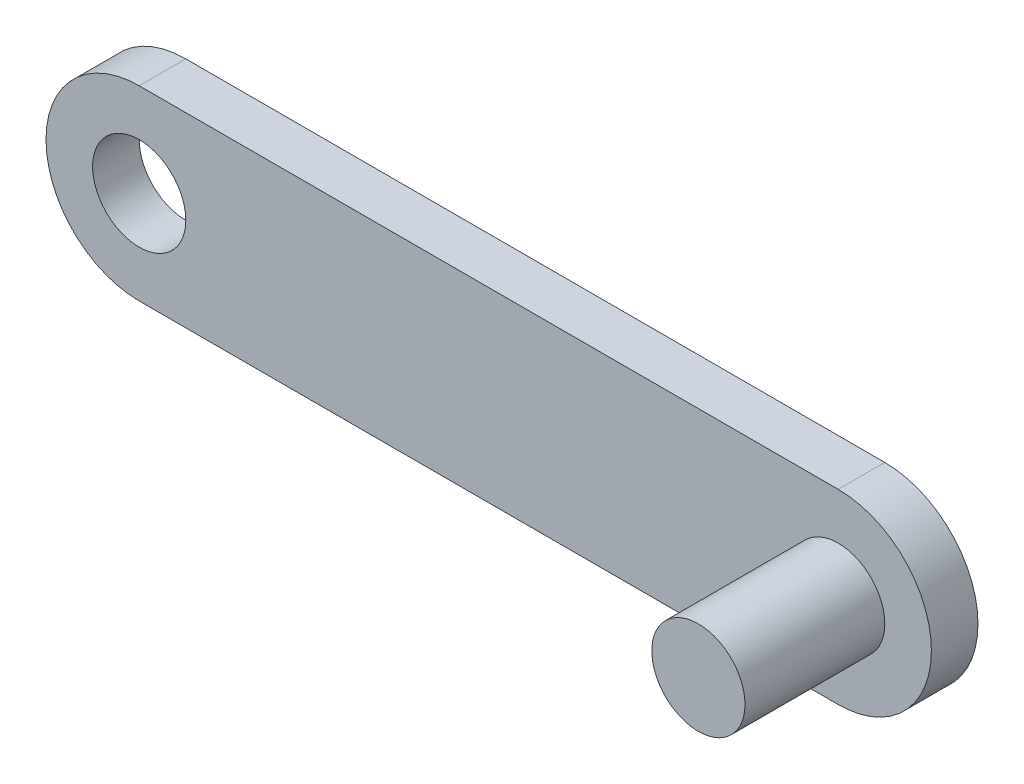
ISO-10303-21;
HEADER;
FILE_DESCRIPTION(('STEP AP214'),'2;1');
FILE_NAME('part.step','',(''),(''),'','','');
FILE_SCHEMA(('AUTOMOTIVE_DESIGN { 1 0 10303 214 1 1 1 1 }'));
ENDSEC;
DATA;
#1=APPLICATION_CONTEXT('core data for automotive mechanical design processes');
#2=APPLICATION_PROTOCOL_DEFINITION('international standard','automotive_design',2000,#1);
#3=PRODUCT_CONTEXT('',#1,'mechanical');
#4=PRODUCT('Part','Part','',(#3));
#5=PRODUCT_RELATED_PRODUCT_CATEGORY('part','',(#4));
#6=PRODUCT_DEFINITION_FORMATION('','',#4);
#7=PRODUCT_DEFINITION_CONTEXT('part definition',#1,'design');
#8=PRODUCT_DEFINITION('design','',#6,#7);
#9=PRODUCT_DEFINITION_SHAPE('','',#8);
#10=(LENGTH_UNIT() NAMED_UNIT(*) SI_UNIT(.MILLI.,.METRE.));
#11=(NAMED_UNIT(*) PLANE_ANGLE_UNIT() SI_UNIT($,.RADIAN.));
#12=(NAMED_UNIT(*) SI_UNIT($,.STERADIAN.) SOLID_ANGLE_UNIT());
#13=UNCERTAINTY_MEASURE_WITH_UNIT(LENGTH_MEASURE(1.E-05),#10,'distance_accuracy_value','');
#14=(GEOMETRIC_REPRESENTATION_CONTEXT(3) GLOBAL_UNCERTAINTY_ASSIGNED_CONTEXT((#13)) GLOBAL_UNIT_ASSIGNED_CONTEXT((#10,
#11,#12)) REPRESENTATION_CONTEXT('',''));
#15=CARTESIAN_POINT('',(0.,0.,0.));
#16=DIRECTION('',(0.,0.,1.));
#17=DIRECTION('',(1.,0.,0.));
#18=AXIS2_PLACEMENT_3D('',#15,#16,#17);
#19=CARTESIAN_POINT('',(0.,0.,1.));
#20=DIRECTION('',(0.,0.,1.));
#21=DIRECTION('',(1.,0.,0.));
#22=AXIS2_PLACEMENT_3D('',#19,#20,#21);
#23=PLANE('',#22);
#24=CARTESIAN_POINT('',(15.,0.,1.));
#25=DIRECTION('',(0.,0.,1.));
#26=DIRECTION('',(1.,0.,0.));
#27=AXIS2_PLACEMENT_3D('',#24,#25,#26);
#28=CIRCLE('',#27,1.);
#29=CARTESIAN_POINT('',(16.,0.,1.));
#30=VERTEX_POINT('',#29);
#31=EDGE_CURVE('E138',#30,#30,#28,.T.);
#32=ORIENTED_EDGE('',*,*,#31,.F.);
#33=EDGE_LOOP('',(#32));
#34=FACE_BOUND('',#33,.T.);
#35=CARTESIAN_POINT('',(0.,0.,1.));
#36=DIRECTION('',(0.,0.,1.));
#37=DIRECTION('',(1.,0.,0.));
#38=AXIS2_PLACEMENT_3D('',#35,#36,#37);
#39=CIRCLE('',#38,2.);
#40=CARTESIAN_POINT('',(0.,2.,1.));
#41=VERTEX_POINT('',#40);
#42=CARTESIAN_POINT('',(0.,-2.,1.));
#43=VERTEX_POINT('',#42);
#44=EDGE_CURVE('E92',#41,#43,#39,.T.);
#45=ORIENTED_EDGE('',*,*,#44,.T.);
#46=DIRECTION('',(1.,0.,0.));
#47=VECTOR('',#46,1.);
#48=CARTESIAN_POINT('',(0.,-2.,1.));
#49=LINE('',#48,#47);
#50=CARTESIAN_POINT('',(15.,-2.,1.));
#51=VERTEX_POINT('',#50);
#52=EDGE_CURVE('E87',#43,#51,#49,.T.);
#53=ORIENTED_EDGE('',*,*,#52,.T.);
#54=CARTESIAN_POINT('',(15.,0.,1.));
#55=DIRECTION('',(0.,0.,1.));
#56=DIRECTION('',(1.,0.,0.));
#57=AXIS2_PLACEMENT_3D('',#54,#55,#56);
#58=CIRCLE('',#57,2.);
#59=CARTESIAN_POINT('',(15.,2.,1.));
#60=VERTEX_POINT('',#59);
#61=EDGE_CURVE('E90',#51,#60,#58,.T.);
#62=ORIENTED_EDGE('',*,*,#61,.T.);
#63=DIRECTION('',(-1.,0.,0.));
#64=VECTOR('',#63,1.);
#65=CARTESIAN_POINT('',(0.,2.,1.));
#66=LINE('',#65,#64);
#67=EDGE_CURVE('E57',#60,#41,#66,.T.);
#68=ORIENTED_EDGE('',*,*,#67,.T.);
#69=EDGE_LOOP('',(#45,#53,#62,#68));
#70=FACE_BOUND('',#69,.T.);
#71=CARTESIAN_POINT('',(0.,0.,1.));
#72=DIRECTION('',(0.,0.,1.));
#73=DIRECTION('',(1.,0.,0.));
#74=AXIS2_PLACEMENT_3D('',#71,#72,#73);
#75=CIRCLE('',#74,1.);
#76=CARTESIAN_POINT('',(1.,0.,1.));
#77=VERTEX_POINT('',#76);
#78=EDGE_CURVE('E112',#77,#77,#75,.T.);
#79=ORIENTED_EDGE('',*,*,#78,.F.);
#80=EDGE_LOOP('',(#79));
#81=FACE_BOUND('',#80,.T.);
#82=ADVANCED_FACE('F39',(#34,#70,#81),#23,.T.);
#83=CARTESIAN_POINT('',(0.,0.,0.));
#84=DIRECTION('',(0.,0.,1.));
#85=DIRECTION('',(1.,0.,0.));
#86=AXIS2_PLACEMENT_3D('',#83,#84,#85);
#87=PLANE('',#86);
#88=CARTESIAN_POINT('',(0.,0.,0.));
#89=DIRECTION('',(0.,0.,1.));
#90=DIRECTION('',(1.,0.,0.));
#91=AXIS2_PLACEMENT_3D('',#88,#89,#90);
#92=CIRCLE('',#91,2.);
#93=CARTESIAN_POINT('',(0.,2.,0.));
#94=VERTEX_POINT('',#93);
#95=CARTESIAN_POINT('',(0.,-2.,0.));
#96=VERTEX_POINT('',#95);
#97=EDGE_CURVE('E108',#94,#96,#92,.T.);
#98=ORIENTED_EDGE('',*,*,#97,.F.);
#99=DIRECTION('',(-1.,0.,0.));
#100=VECTOR('',#99,1.);
#101=CARTESIAN_POINT('',(0.,2.,0.));
#102=LINE('',#101,#100);
#103=CARTESIAN_POINT('',(15.,2.,0.));
#104=VERTEX_POINT('',#103);
#105=EDGE_CURVE('E80',#104,#94,#102,.T.);
#106=ORIENTED_EDGE('',*,*,#105,.F.);
#107=CARTESIAN_POINT('',(15.,0.,0.));
#108=DIRECTION('',(0.,0.,1.));
#109=DIRECTION('',(1.,0.,0.));
#110=AXIS2_PLACEMENT_3D('',#107,#108,#109);
#111=CIRCLE('',#110,2.);
#112=CARTESIAN_POINT('',(15.,-2.,0.));
#113=VERTEX_POINT('',#112);
#114=EDGE_CURVE('E74',#113,#104,#111,.T.);
#115=ORIENTED_EDGE('',*,*,#114,.F.);
#116=DIRECTION('',(1.,0.,0.));
#117=VECTOR('',#116,1.);
#118=CARTESIAN_POINT('',(0.,-2.,0.));
#119=LINE('',#118,#117);
#120=EDGE_CURVE('E97',#96,#113,#119,.T.);
#121=ORIENTED_EDGE('',*,*,#120,.F.);
#122=EDGE_LOOP('',(#98,#106,#115,#121));
#123=FACE_BOUND('',#122,.T.);
#124=CARTESIAN_POINT('',(0.,0.,0.));
#125=DIRECTION('',(0.,0.,1.));
#126=DIRECTION('',(1.,0.,0.));
#127=AXIS2_PLACEMENT_3D('',#124,#125,#126);
#128=CIRCLE('',#127,1.);
#129=CARTESIAN_POINT('',(1.,0.,0.));
#130=VERTEX_POINT('',#129);
#131=EDGE_CURVE('E130',#130,#130,#128,.T.);
#132=ORIENTED_EDGE('',*,*,#131,.T.);
#133=EDGE_LOOP('',(#132));
#134=FACE_BOUND('',#133,.T.);
#135=ADVANCED_FACE('F125',(#123,#134),#87,.F.);
#136=CARTESIAN_POINT('',(0.,0.,1.));
#137=DIRECTION('',(0.,0.,-1.));
#138=DIRECTION('',(-1.,0.,0.));
#139=AXIS2_PLACEMENT_3D('',#136,#137,#138);
#140=CYLINDRICAL_SURFACE('',#139,2.);
#141=ORIENTED_EDGE('',*,*,#97,.T.);
#142=DIRECTION('',(0.,0.,-1.));
#143=VECTOR('',#142,1.);
#144=CARTESIAN_POINT('',(0.,-2.,1.));
#145=LINE('',#144,#143);
#146=EDGE_CURVE('E11',#43,#96,#145,.T.);
#147=ORIENTED_EDGE('',*,*,#146,.F.);
#148=ORIENTED_EDGE('',*,*,#44,.F.);
#149=DIRECTION('',(0.,0.,-1.));
#150=VECTOR('',#149,1.);
#151=CARTESIAN_POINT('',(0.,2.,1.));
#152=LINE('',#151,#150);
#153=EDGE_CURVE('E104',#41,#94,#152,.T.);
#154=ORIENTED_EDGE('',*,*,#153,.T.);
#155=EDGE_LOOP('',(#141,#147,#148,#154));
#156=FACE_BOUND('',#155,.T.);
#157=ADVANCED_FACE('F41',(#156),#140,.T.);
#158=CARTESIAN_POINT('',(0.,-2.,1.));
#159=DIRECTION('',(0.,1.,0.));
#160=DIRECTION('',(0.,0.,1.));
#161=AXIS2_PLACEMENT_3D('',#158,#159,#160);
#162=PLANE('',#161);
#163=ORIENTED_EDGE('',*,*,#120,.T.);
#164=DIRECTION('',(0.,0.,-1.));
#165=VECTOR('',#164,1.);
#166=CARTESIAN_POINT('',(15.,-2.,1.));
#167=LINE('',#166,#165);
#168=EDGE_CURVE('E49',#51,#113,#167,.T.);
#169=ORIENTED_EDGE('',*,*,#168,.F.);
#170=ORIENTED_EDGE('',*,*,#52,.F.);
#171=ORIENTED_EDGE('',*,*,#146,.T.);
#172=EDGE_LOOP('',(#163,#169,#170,#171));
#173=FACE_BOUND('',#172,.T.);
#174=ADVANCED_FACE('F96',(#173),#162,.F.);
#175=CARTESIAN_POINT('',(15.,0.,1.));
#176=DIRECTION('',(0.,0.,-1.));
#177=DIRECTION('',(-1.,0.,0.));
#178=AXIS2_PLACEMENT_3D('',#175,#176,#177);
#179=CYLINDRICAL_SURFACE('',#178,2.);
#180=ORIENTED_EDGE('',*,*,#114,.T.);
#181=DIRECTION('',(0.,0.,-1.));
#182=VECTOR('',#181,1.);
#183=CARTESIAN_POINT('',(15.,2.,1.));
#184=LINE('',#183,#182);
#185=EDGE_CURVE('E99',#60,#104,#184,.T.);
#186=ORIENTED_EDGE('',*,*,#185,.F.);
#187=ORIENTED_EDGE('',*,*,#61,.F.);
#188=ORIENTED_EDGE('',*,*,#168,.T.);
#189=EDGE_LOOP('',(#180,#186,#187,#188));
#190=FACE_BOUND('',#189,.T.);
#191=ADVANCED_FACE('F100',(#190),#179,.T.);
#192=CARTESIAN_POINT('',(0.,2.,1.));
#193=DIRECTION('',(0.,-1.,0.));
#194=DIRECTION('',(0.,0.,-1.));
#195=AXIS2_PLACEMENT_3D('',#192,#193,#194);
#196=PLANE('',#195);
#197=ORIENTED_EDGE('',*,*,#105,.T.);
#198=ORIENTED_EDGE('',*,*,#153,.F.);
#199=ORIENTED_EDGE('',*,*,#67,.F.);
#200=ORIENTED_EDGE('',*,*,#185,.T.);
#201=EDGE_LOOP('',(#197,#198,#199,#200));
#202=FACE_BOUND('',#201,.T.);
#203=ADVANCED_FACE('F122',(#202),#196,.F.);
#204=CARTESIAN_POINT('',(0.,0.,1.));
#205=DIRECTION('',(0.,0.,-1.));
#206=DIRECTION('',(-1.,0.,0.));
#207=AXIS2_PLACEMENT_3D('',#204,#205,#206);
#208=CYLINDRICAL_SURFACE('',#207,1.);
#209=ORIENTED_EDGE('',*,*,#78,.T.);
#210=EDGE_LOOP('',(#209));
#211=FACE_BOUND('',#210,.T.);
#212=ORIENTED_EDGE('',*,*,#131,.F.);
#213=EDGE_LOOP('',(#212));
#214=FACE_BOUND('',#213,.T.);
#215=ADVANCED_FACE('F151',(#211,#214),#208,.F.);
#216=CARTESIAN_POINT('',(15.,0.,4.));
#217=DIRECTION('',(0.,0.,-1.));
#218=DIRECTION('',(-1.,0.,0.));
#219=AXIS2_PLACEMENT_3D('',#216,#217,#218);
#220=CYLINDRICAL_SURFACE('',#219,1.);
#221=CARTESIAN_POINT('',(15.,0.,4.));
#222=DIRECTION('',(0.,0.,1.));
#223=DIRECTION('',(1.,0.,0.));
#224=AXIS2_PLACEMENT_3D('',#221,#222,#223);
#225=CIRCLE('',#224,1.);
#226=CARTESIAN_POINT('',(16.,0.,4.));
#227=VERTEX_POINT('',#226);
#228=EDGE_CURVE('E134',#227,#227,#225,.T.);
#229=ORIENTED_EDGE('',*,*,#228,.F.);
#230=EDGE_LOOP('',(#229));
#231=FACE_BOUND('',#230,.T.);
#232=ORIENTED_EDGE('',*,*,#31,.T.);
#233=EDGE_LOOP('',(#232));
#234=FACE_BOUND('',#233,.T.);
#235=ADVANCED_FACE('F148',(#231,#234),#220,.T.);
#236=CARTESIAN_POINT('',(15.,0.,4.));
#237=DIRECTION('',(0.,0.,1.));
#238=DIRECTION('',(1.,0.,0.));
#239=AXIS2_PLACEMENT_3D('',#236,#237,#238);
#240=PLANE('',#239);
#241=ORIENTED_EDGE('',*,*,#228,.T.);
#242=EDGE_LOOP('',(#241));
#243=FACE_BOUND('',#242,.T.);
#244=ADVANCED_FACE('F146',(#243),#240,.T.);
#245=CLOSED_SHELL('',(#82,#135,#157,#174,#191,#203,#215,#235,#244));
#246=MANIFOLD_SOLID_BREP('B2',#245);
#247=ADVANCED_BREP_SHAPE_REPRESENTATION('',(#18,#246),#14);
#248=SHAPE_DEFINITION_REPRESENTATION(#9,#247);
ENDSEC;
END-ISO-10303-21;
